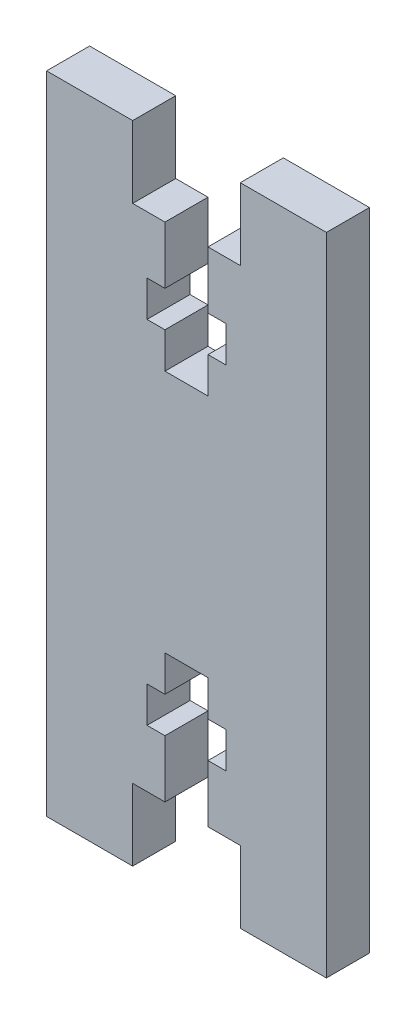
ISO-10303-21;
HEADER;
FILE_DESCRIPTION(('STEP AP214'),'2;1');
FILE_NAME('part.step','',(''),(''),'','','');
FILE_SCHEMA(('AUTOMOTIVE_DESIGN { 1 0 10303 214 1 1 1 1 }'));
ENDSEC;
DATA;
#1=APPLICATION_CONTEXT('core data for automotive mechanical design processes');
#2=APPLICATION_PROTOCOL_DEFINITION('international standard','automotive_design',2000,#1);
#3=PRODUCT_CONTEXT('',#1,'mechanical');
#4=PRODUCT('Part','Part','',(#3));
#5=PRODUCT_RELATED_PRODUCT_CATEGORY('part','',(#4));
#6=PRODUCT_DEFINITION_FORMATION('','',#4);
#7=PRODUCT_DEFINITION_CONTEXT('part definition',#1,'design');
#8=PRODUCT_DEFINITION('design','',#6,#7);
#9=PRODUCT_DEFINITION_SHAPE('','',#8);
#10=(LENGTH_UNIT() NAMED_UNIT(*) SI_UNIT(.MILLI.,.METRE.));
#11=(NAMED_UNIT(*) PLANE_ANGLE_UNIT() SI_UNIT($,.RADIAN.));
#12=(NAMED_UNIT(*) SI_UNIT($,.STERADIAN.) SOLID_ANGLE_UNIT());
#13=UNCERTAINTY_MEASURE_WITH_UNIT(LENGTH_MEASURE(1.E-05),#10,'distance_accuracy_value','');
#14=(GEOMETRIC_REPRESENTATION_CONTEXT(3) GLOBAL_UNCERTAINTY_ASSIGNED_CONTEXT((#13)) GLOBAL_UNIT_ASSIGNED_CONTEXT((#10,
#11,#12)) REPRESENTATION_CONTEXT('',''));
#15=CARTESIAN_POINT('',(0.,0.,0.));
#16=DIRECTION('',(0.,0.,1.));
#17=DIRECTION('',(1.,0.,0.));
#18=AXIS2_PLACEMENT_3D('',#15,#16,#17);
#19=CARTESIAN_POINT('',(0.,0.,3.));
#20=DIRECTION('',(-1.,0.,0.));
#21=DIRECTION('',(0.,0.,1.));
#22=AXIS2_PLACEMENT_3D('',#19,#20,#21);
#23=PLANE('',#22);
#24=DIRECTION('',(0.,1.,0.));
#25=VECTOR('',#24,1.);
#26=CARTESIAN_POINT('',(0.,0.,0.));
#27=LINE('',#26,#25);
#28=CARTESIAN_POINT('',(0.,0.,0.));
#29=VERTEX_POINT('',#28);
#30=CARTESIAN_POINT('',(0.,5.,0.));
#31=VERTEX_POINT('',#30);
#32=EDGE_CURVE('E308',#29,#31,#27,.T.);
#33=ORIENTED_EDGE('',*,*,#32,.T.);
#34=DIRECTION('',(0.,0.,-1.));
#35=VECTOR('',#34,1.);
#36=CARTESIAN_POINT('',(0.,5.,3.));
#37=LINE('',#36,#35);
#38=CARTESIAN_POINT('',(0.,5.,3.));
#39=VERTEX_POINT('',#38);
#40=EDGE_CURVE('E11',#39,#31,#37,.T.);
#41=ORIENTED_EDGE('',*,*,#40,.F.);
#42=DIRECTION('',(0.,1.,0.));
#43=VECTOR('',#42,1.);
#44=CARTESIAN_POINT('',(0.,0.,3.));
#45=LINE('',#44,#43);
#46=CARTESIAN_POINT('',(0.,0.,3.));
#47=VERTEX_POINT('',#46);
#48=EDGE_CURVE('E416',#47,#39,#45,.T.);
#49=ORIENTED_EDGE('',*,*,#48,.F.);
#50=DIRECTION('',(0.,0.,-1.));
#51=VECTOR('',#50,1.);
#52=CARTESIAN_POINT('',(0.,0.,3.));
#53=LINE('',#52,#51);
#54=EDGE_CURVE('E304',#47,#29,#53,.T.);
#55=ORIENTED_EDGE('',*,*,#54,.T.);
#56=EDGE_LOOP('',(#33,#41,#49,#55));
#57=FACE_BOUND('',#56,.T.);
#58=ADVANCED_FACE('F39',(#57),#23,.F.);
#59=CARTESIAN_POINT('',(0.,5.,3.));
#60=DIRECTION('',(0.,-1.,0.));
#61=DIRECTION('',(1.,0.,0.));
#62=AXIS2_PLACEMENT_3D('',#59,#60,#61);
#63=PLANE('',#62);
#64=DIRECTION('',(-1.,0.,0.));
#65=VECTOR('',#64,1.);
#66=CARTESIAN_POINT('',(0.,5.,0.));
#67=LINE('',#66,#65);
#68=CARTESIAN_POINT('',(-6.,5.,0.));
#69=VERTEX_POINT('',#68);
#70=EDGE_CURVE('E312',#31,#69,#67,.T.);
#71=ORIENTED_EDGE('',*,*,#70,.T.);
#72=DIRECTION('',(0.,0.,-1.));
#73=VECTOR('',#72,1.);
#74=CARTESIAN_POINT('',(-6.,5.,3.));
#75=LINE('',#74,#73);
#76=CARTESIAN_POINT('',(-6.,5.,3.));
#77=VERTEX_POINT('',#76);
#78=EDGE_CURVE('E48',#77,#69,#75,.T.);
#79=ORIENTED_EDGE('',*,*,#78,.F.);
#80=DIRECTION('',(-1.,0.,0.));
#81=VECTOR('',#80,1.);
#82=CARTESIAN_POINT('',(0.,5.,3.));
#83=LINE('',#82,#81);
#84=EDGE_CURVE('E183',#39,#77,#83,.T.);
#85=ORIENTED_EDGE('',*,*,#84,.F.);
#86=ORIENTED_EDGE('',*,*,#40,.T.);
#87=EDGE_LOOP('',(#71,#79,#85,#86));
#88=FACE_BOUND('',#87,.T.);
#89=ADVANCED_FACE('F549',(#88),#63,.F.);
#90=CARTESIAN_POINT('',(-6.,-40.,3.));
#91=DIRECTION('',(1.,0.,0.));
#92=DIRECTION('',(0.,0.,-1.));
#93=AXIS2_PLACEMENT_3D('',#90,#91,#92);
#94=PLANE('',#93);
#95=DIRECTION('',(0.,-1.,0.));
#96=VECTOR('',#95,1.);
#97=CARTESIAN_POINT('',(-6.,-40.,0.));
#98=LINE('',#97,#96);
#99=CARTESIAN_POINT('',(-6.,-40.,0.));
#100=VERTEX_POINT('',#99);
#101=EDGE_CURVE('E316',#69,#100,#98,.T.);
#102=ORIENTED_EDGE('',*,*,#101,.T.);
#103=DIRECTION('',(0.,0.,-1.));
#104=VECTOR('',#103,1.);
#105=CARTESIAN_POINT('',(-6.,-40.,3.));
#106=LINE('',#105,#104);
#107=CARTESIAN_POINT('',(-6.,-40.,3.));
#108=VERTEX_POINT('',#107);
#109=EDGE_CURVE('E539',#108,#100,#106,.T.);
#110=ORIENTED_EDGE('',*,*,#109,.F.);
#111=DIRECTION('',(0.,-1.,0.));
#112=VECTOR('',#111,1.);
#113=CARTESIAN_POINT('',(-6.,5.,3.));
#114=LINE('',#113,#112);
#115=EDGE_CURVE('E548',#77,#108,#114,.T.);
#116=ORIENTED_EDGE('',*,*,#115,.F.);
#117=ORIENTED_EDGE('',*,*,#78,.T.);
#118=EDGE_LOOP('',(#102,#110,#116,#117));
#119=FACE_BOUND('',#118,.T.);
#120=ADVANCED_FACE('F546',(#119),#94,.F.);
#121=CARTESIAN_POINT('',(0.,-40.,3.));
#122=DIRECTION('',(0.,1.,0.));
#123=DIRECTION('',(-1.,0.,0.));
#124=AXIS2_PLACEMENT_3D('',#121,#122,#123);
#125=PLANE('',#124);
#126=DIRECTION('',(1.,0.,0.));
#127=VECTOR('',#126,1.);
#128=CARTESIAN_POINT('',(0.,-40.,0.));
#129=LINE('',#128,#127);
#130=CARTESIAN_POINT('',(0.,-40.,0.));
#131=VERTEX_POINT('',#130);
#132=EDGE_CURVE('E319',#100,#131,#129,.T.);
#133=ORIENTED_EDGE('',*,*,#132,.T.);
#134=DIRECTION('',(0.,0.,-1.));
#135=VECTOR('',#134,1.);
#136=CARTESIAN_POINT('',(0.,-40.,3.));
#137=LINE('',#136,#135);
#138=CARTESIAN_POINT('',(0.,-40.,3.));
#139=VERTEX_POINT('',#138);
#140=EDGE_CURVE('E535',#139,#131,#137,.T.);
#141=ORIENTED_EDGE('',*,*,#140,.F.);
#142=DIRECTION('',(1.,0.,0.));
#143=VECTOR('',#142,1.);
#144=CARTESIAN_POINT('',(0.,-40.,3.));
#145=LINE('',#144,#143);
#146=EDGE_CURVE('E569',#108,#139,#145,.T.);
#147=ORIENTED_EDGE('',*,*,#146,.F.);
#148=ORIENTED_EDGE('',*,*,#109,.T.);
#149=EDGE_LOOP('',(#133,#141,#147,#148));
#150=FACE_BOUND('',#149,.T.);
#151=ADVANCED_FACE('F559',(#150),#125,.F.);
#152=CARTESIAN_POINT('',(0.,-35.,3.));
#153=DIRECTION('',(-1.,0.,0.));
#154=DIRECTION('',(0.,0.,1.));
#155=AXIS2_PLACEMENT_3D('',#152,#153,#154);
#156=PLANE('',#155);
#157=DIRECTION('',(0.,1.,0.));
#158=VECTOR('',#157,1.);
#159=CARTESIAN_POINT('',(0.,-35.,0.));
#160=LINE('',#159,#158);
#161=CARTESIAN_POINT('',(0.,-35.,0.));
#162=VERTEX_POINT('',#161);
#163=EDGE_CURVE('E322',#131,#162,#160,.T.);
#164=ORIENTED_EDGE('',*,*,#163,.T.);
#165=DIRECTION('',(0.,0.,-1.));
#166=VECTOR('',#165,1.);
#167=CARTESIAN_POINT('',(0.,-35.,3.));
#168=LINE('',#167,#166);
#169=CARTESIAN_POINT('',(0.,-35.,3.));
#170=VERTEX_POINT('',#169);
#171=EDGE_CURVE('E531',#170,#162,#168,.T.);
#172=ORIENTED_EDGE('',*,*,#171,.F.);
#173=DIRECTION('',(0.,1.,0.));
#174=VECTOR('',#173,1.);
#175=CARTESIAN_POINT('',(0.,-35.,3.));
#176=LINE('',#175,#174);
#177=EDGE_CURVE('E565',#139,#170,#176,.T.);
#178=ORIENTED_EDGE('',*,*,#177,.F.);
#179=ORIENTED_EDGE('',*,*,#140,.T.);
#180=EDGE_LOOP('',(#164,#172,#178,#179));
#181=FACE_BOUND('',#180,.T.);
#182=ADVANCED_FACE('F563',(#181),#156,.F.);
#183=CARTESIAN_POINT('',(0.,-35.,3.));
#184=DIRECTION('',(0.,1.,0.));
#185=DIRECTION('',(-1.,0.,0.));
#186=AXIS2_PLACEMENT_3D('',#183,#184,#185);
#187=PLANE('',#186);
#188=DIRECTION('',(1.,0.,0.));
#189=VECTOR('',#188,1.);
#190=CARTESIAN_POINT('',(0.,-35.,0.));
#191=LINE('',#190,#189);
#192=CARTESIAN_POINT('',(2.25,-35.,0.));
#193=VERTEX_POINT('',#192);
#194=EDGE_CURVE('E325',#162,#193,#191,.T.);
#195=ORIENTED_EDGE('',*,*,#194,.T.);
#196=DIRECTION('',(0.,0.,-1.));
#197=VECTOR('',#196,1.);
#198=CARTESIAN_POINT('',(2.25,-35.,3.));
#199=LINE('',#198,#197);
#200=CARTESIAN_POINT('',(2.25,-35.,3.));
#201=VERTEX_POINT('',#200);
#202=EDGE_CURVE('E527',#201,#193,#199,.T.);
#203=ORIENTED_EDGE('',*,*,#202,.F.);
#204=DIRECTION('',(1.,0.,0.));
#205=VECTOR('',#204,1.);
#206=CARTESIAN_POINT('',(0.,-35.,3.));
#207=LINE('',#206,#205);
#208=EDGE_CURVE('E568',#170,#201,#207,.T.);
#209=ORIENTED_EDGE('',*,*,#208,.F.);
#210=ORIENTED_EDGE('',*,*,#171,.T.);
#211=EDGE_LOOP('',(#195,#203,#209,#210));
#212=FACE_BOUND('',#211,.T.);
#213=ADVANCED_FACE('F789',(#212),#187,.F.);
#214=CARTESIAN_POINT('',(2.24999999999993,-31.,3.));
#215=DIRECTION('',(-1.,0.,0.));
#216=DIRECTION('',(0.,-1.,0.));
#217=AXIS2_PLACEMENT_3D('',#214,#215,#216);
#218=PLANE('',#217);
#219=DIRECTION('',(0.,1.,0.));
#220=VECTOR('',#219,1.);
#221=CARTESIAN_POINT('',(2.24999999999993,-31.,0.));
#222=LINE('',#221,#220);
#223=CARTESIAN_POINT('',(2.24999999999993,-31.,0.));
#224=VERTEX_POINT('',#223);
#225=EDGE_CURVE('E328',#193,#224,#222,.T.);
#226=ORIENTED_EDGE('',*,*,#225,.T.);
#227=DIRECTION('',(0.,0.,-1.));
#228=VECTOR('',#227,1.);
#229=CARTESIAN_POINT('',(2.24999999999993,-31.,3.));
#230=LINE('',#229,#228);
#231=CARTESIAN_POINT('',(2.24999999999993,-31.,3.));
#232=VERTEX_POINT('',#231);
#233=EDGE_CURVE('E523',#232,#224,#230,.T.);
#234=ORIENTED_EDGE('',*,*,#233,.F.);
#235=DIRECTION('',(0.,1.,0.));
#236=VECTOR('',#235,1.);
#237=CARTESIAN_POINT('',(2.24999999999993,-31.,3.));
#238=LINE('',#237,#236);
#239=EDGE_CURVE('E573',#201,#232,#238,.T.);
#240=ORIENTED_EDGE('',*,*,#239,.F.);
#241=ORIENTED_EDGE('',*,*,#202,.T.);
#242=EDGE_LOOP('',(#226,#234,#240,#241));
#243=FACE_BOUND('',#242,.T.);
#244=ADVANCED_FACE('F785',(#243),#218,.F.);
#245=CARTESIAN_POINT('',(0.999999999999927,-31.,3.));
#246=DIRECTION('',(0.,-1.,0.));
#247=DIRECTION('',(1.,0.,0.));
#248=AXIS2_PLACEMENT_3D('',#245,#246,#247);
#249=PLANE('',#248);
#250=DIRECTION('',(-1.,0.,0.));
#251=VECTOR('',#250,1.);
#252=CARTESIAN_POINT('',(0.999999999999927,-31.,0.));
#253=LINE('',#252,#251);
#254=CARTESIAN_POINT('',(0.999999999999927,-31.,0.));
#255=VERTEX_POINT('',#254);
#256=EDGE_CURVE('E331',#224,#255,#253,.T.);
#257=ORIENTED_EDGE('',*,*,#256,.T.);
#258=DIRECTION('',(0.,0.,-1.));
#259=VECTOR('',#258,1.);
#260=CARTESIAN_POINT('',(0.999999999999927,-31.,3.));
#261=LINE('',#260,#259);
#262=CARTESIAN_POINT('',(0.999999999999927,-31.,3.));
#263=VERTEX_POINT('',#262);
#264=EDGE_CURVE('E519',#263,#255,#261,.T.);
#265=ORIENTED_EDGE('',*,*,#264,.F.);
#266=DIRECTION('',(-1.,0.,0.));
#267=VECTOR('',#266,1.);
#268=CARTESIAN_POINT('',(0.999999999999927,-31.,3.));
#269=LINE('',#268,#267);
#270=EDGE_CURVE('E580',#232,#263,#269,.T.);
#271=ORIENTED_EDGE('',*,*,#270,.F.);
#272=ORIENTED_EDGE('',*,*,#233,.T.);
#273=EDGE_LOOP('',(#257,#265,#271,#272));
#274=FACE_BOUND('',#273,.T.);
#275=ADVANCED_FACE('F781',(#274),#249,.F.);
#276=CARTESIAN_POINT('',(0.999999999999882,-28.5,3.));
#277=DIRECTION('',(-1.,0.,0.));
#278=DIRECTION('',(0.,-1.,0.));
#279=AXIS2_PLACEMENT_3D('',#276,#277,#278);
#280=PLANE('',#279);
#281=DIRECTION('',(0.,1.,0.));
#282=VECTOR('',#281,1.);
#283=CARTESIAN_POINT('',(0.999999999999882,-28.5,0.));
#284=LINE('',#283,#282);
#285=CARTESIAN_POINT('',(0.999999999999882,-28.5,0.));
#286=VERTEX_POINT('',#285);
#287=EDGE_CURVE('E334',#255,#286,#284,.T.);
#288=ORIENTED_EDGE('',*,*,#287,.T.);
#289=DIRECTION('',(0.,0.,-1.));
#290=VECTOR('',#289,1.);
#291=CARTESIAN_POINT('',(0.999999999999882,-28.5,3.));
#292=LINE('',#291,#290);
#293=CARTESIAN_POINT('',(0.999999999999882,-28.5,3.));
#294=VERTEX_POINT('',#293);
#295=EDGE_CURVE('E515',#294,#286,#292,.T.);
#296=ORIENTED_EDGE('',*,*,#295,.F.);
#297=DIRECTION('',(0.,1.,0.));
#298=VECTOR('',#297,1.);
#299=CARTESIAN_POINT('',(0.999999999999882,-28.5,3.));
#300=LINE('',#299,#298);
#301=EDGE_CURVE('E583',#263,#294,#300,.T.);
#302=ORIENTED_EDGE('',*,*,#301,.F.);
#303=ORIENTED_EDGE('',*,*,#264,.T.);
#304=EDGE_LOOP('',(#288,#296,#302,#303));
#305=FACE_BOUND('',#304,.T.);
#306=ADVANCED_FACE('F777',(#305),#280,.F.);
#307=CARTESIAN_POINT('',(2.2499999999999,-28.5,3.));
#308=DIRECTION('',(0.,1.,0.));
#309=DIRECTION('',(-1.,0.,0.));
#310=AXIS2_PLACEMENT_3D('',#307,#308,#309);
#311=PLANE('',#310);
#312=DIRECTION('',(1.,0.,0.));
#313=VECTOR('',#312,1.);
#314=CARTESIAN_POINT('',(2.2499999999999,-28.5,0.));
#315=LINE('',#314,#313);
#316=CARTESIAN_POINT('',(2.2499999999999,-28.5,0.));
#317=VERTEX_POINT('',#316);
#318=EDGE_CURVE('E337',#286,#317,#315,.T.);
#319=ORIENTED_EDGE('',*,*,#318,.T.);
#320=DIRECTION('',(0.,0.,-1.));
#321=VECTOR('',#320,1.);
#322=CARTESIAN_POINT('',(2.2499999999999,-28.5,3.));
#323=LINE('',#322,#321);
#324=CARTESIAN_POINT('',(2.2499999999999,-28.5,3.));
#325=VERTEX_POINT('',#324);
#326=EDGE_CURVE('E511',#325,#317,#323,.T.);
#327=ORIENTED_EDGE('',*,*,#326,.F.);
#328=DIRECTION('',(1.,0.,0.));
#329=VECTOR('',#328,1.);
#330=CARTESIAN_POINT('',(2.2499999999999,-28.5,3.));
#331=LINE('',#330,#329);
#332=EDGE_CURVE('E586',#294,#325,#331,.T.);
#333=ORIENTED_EDGE('',*,*,#332,.F.);
#334=ORIENTED_EDGE('',*,*,#295,.T.);
#335=EDGE_LOOP('',(#319,#327,#333,#334));
#336=FACE_BOUND('',#335,.T.);
#337=ADVANCED_FACE('F772',(#336),#311,.F.);
#338=CARTESIAN_POINT('',(2.24999999999986,-26.,3.));
#339=DIRECTION('',(-1.,0.,0.));
#340=DIRECTION('',(0.,-1.,0.));
#341=AXIS2_PLACEMENT_3D('',#338,#339,#340);
#342=PLANE('',#341);
#343=DIRECTION('',(0.,1.,0.));
#344=VECTOR('',#343,1.);
#345=CARTESIAN_POINT('',(2.24999999999986,-26.,0.));
#346=LINE('',#345,#344);
#347=CARTESIAN_POINT('',(2.24999999999986,-26.,0.));
#348=VERTEX_POINT('',#347);
#349=EDGE_CURVE('E340',#317,#348,#346,.T.);
#350=ORIENTED_EDGE('',*,*,#349,.T.);
#351=DIRECTION('',(0.,0.,-1.));
#352=VECTOR('',#351,1.);
#353=CARTESIAN_POINT('',(2.24999999999986,-26.,3.));
#354=LINE('',#353,#352);
#355=CARTESIAN_POINT('',(2.24999999999986,-26.,3.));
#356=VERTEX_POINT('',#355);
#357=EDGE_CURVE('E507',#356,#348,#354,.T.);
#358=ORIENTED_EDGE('',*,*,#357,.F.);
#359=DIRECTION('',(0.,1.,0.));
#360=VECTOR('',#359,1.);
#361=CARTESIAN_POINT('',(2.24999999999986,-26.,3.));
#362=LINE('',#361,#360);
#363=EDGE_CURVE('E589',#325,#356,#362,.T.);
#364=ORIENTED_EDGE('',*,*,#363,.F.);
#365=ORIENTED_EDGE('',*,*,#326,.T.);
#366=EDGE_LOOP('',(#350,#358,#364,#365));
#367=FACE_BOUND('',#366,.T.);
#368=ADVANCED_FACE('F766',(#367),#342,.F.);
#369=CARTESIAN_POINT('',(5.24999999999985,-26.,3.));
#370=DIRECTION('',(0.,1.,0.));
#371=DIRECTION('',(-1.,0.,0.));
#372=AXIS2_PLACEMENT_3D('',#369,#370,#371);
#373=PLANE('',#372);
#374=DIRECTION('',(1.,0.,0.));
#375=VECTOR('',#374,1.);
#376=CARTESIAN_POINT('',(5.24999999999985,-26.,0.));
#377=LINE('',#376,#375);
#378=CARTESIAN_POINT('',(5.24999999999985,-26.,0.));
#379=VERTEX_POINT('',#378);
#380=EDGE_CURVE('E343',#348,#379,#377,.T.);
#381=ORIENTED_EDGE('',*,*,#380,.T.);
#382=DIRECTION('',(0.,0.,-1.));
#383=VECTOR('',#382,1.);
#384=CARTESIAN_POINT('',(5.24999999999985,-26.,3.));
#385=LINE('',#384,#383);
#386=CARTESIAN_POINT('',(5.24999999999985,-26.,3.));
#387=VERTEX_POINT('',#386);
#388=EDGE_CURVE('E503',#387,#379,#385,.T.);
#389=ORIENTED_EDGE('',*,*,#388,.F.);
#390=DIRECTION('',(1.,0.,0.));
#391=VECTOR('',#390,1.);
#392=CARTESIAN_POINT('',(5.24999999999985,-26.,3.));
#393=LINE('',#392,#391);
#394=EDGE_CURVE('E592',#356,#387,#393,.T.);
#395=ORIENTED_EDGE('',*,*,#394,.F.);
#396=ORIENTED_EDGE('',*,*,#357,.T.);
#397=EDGE_LOOP('',(#381,#389,#395,#396));
#398=FACE_BOUND('',#397,.T.);
#399=ADVANCED_FACE('F762',(#398),#373,.F.);
#400=CARTESIAN_POINT('',(5.2499999999999,-28.5,3.));
#401=DIRECTION('',(1.,0.,0.));
#402=DIRECTION('',(0.,1.,0.));
#403=AXIS2_PLACEMENT_3D('',#400,#401,#402);
#404=PLANE('',#403);
#405=DIRECTION('',(0.,-1.,0.));
#406=VECTOR('',#405,1.);
#407=CARTESIAN_POINT('',(5.2499999999999,-28.5,0.));
#408=LINE('',#407,#406);
#409=CARTESIAN_POINT('',(5.2499999999999,-28.5,0.));
#410=VERTEX_POINT('',#409);
#411=EDGE_CURVE('E346',#379,#410,#408,.T.);
#412=ORIENTED_EDGE('',*,*,#411,.T.);
#413=DIRECTION('',(0.,0.,-1.));
#414=VECTOR('',#413,1.);
#415=CARTESIAN_POINT('',(5.2499999999999,-28.5,3.));
#416=LINE('',#415,#414);
#417=CARTESIAN_POINT('',(5.2499999999999,-28.5,3.));
#418=VERTEX_POINT('',#417);
#419=EDGE_CURVE('E499',#418,#410,#416,.T.);
#420=ORIENTED_EDGE('',*,*,#419,.F.);
#421=DIRECTION('',(0.,-1.,0.));
#422=VECTOR('',#421,1.);
#423=CARTESIAN_POINT('',(5.2499999999999,-28.5,3.));
#424=LINE('',#423,#422);
#425=EDGE_CURVE('E595',#387,#418,#424,.T.);
#426=ORIENTED_EDGE('',*,*,#425,.F.);
#427=ORIENTED_EDGE('',*,*,#388,.T.);
#428=EDGE_LOOP('',(#412,#420,#426,#427));
#429=FACE_BOUND('',#428,.T.);
#430=ADVANCED_FACE('F757',(#429),#404,.F.);
#431=CARTESIAN_POINT('',(6.4999999999999,-28.4999999999999,3.));
#432=DIRECTION('',(0.,1.,0.));
#433=DIRECTION('',(-1.,0.,0.));
#434=AXIS2_PLACEMENT_3D('',#431,#432,#433);
#435=PLANE('',#434);
#436=DIRECTION('',(1.,0.,0.));
#437=VECTOR('',#436,1.);
#438=CARTESIAN_POINT('',(6.4999999999999,-28.4999999999999,0.));
#439=LINE('',#438,#437);
#440=CARTESIAN_POINT('',(6.4999999999999,-28.4999999999999,0.));
#441=VERTEX_POINT('',#440);
#442=EDGE_CURVE('E349',#410,#441,#439,.T.);
#443=ORIENTED_EDGE('',*,*,#442,.T.);
#444=DIRECTION('',(0.,0.,-1.));
#445=VECTOR('',#444,1.);
#446=CARTESIAN_POINT('',(6.4999999999999,-28.4999999999999,3.));
#447=LINE('',#446,#445);
#448=CARTESIAN_POINT('',(6.4999999999999,-28.4999999999999,3.));
#449=VERTEX_POINT('',#448);
#450=EDGE_CURVE('E495',#449,#441,#447,.T.);
#451=ORIENTED_EDGE('',*,*,#450,.F.);
#452=DIRECTION('',(1.,0.,0.));
#453=VECTOR('',#452,1.);
#454=CARTESIAN_POINT('',(6.4999999999999,-28.4999999999999,3.));
#455=LINE('',#454,#453);
#456=EDGE_CURVE('E598',#418,#449,#455,.T.);
#457=ORIENTED_EDGE('',*,*,#456,.F.);
#458=ORIENTED_EDGE('',*,*,#419,.T.);
#459=EDGE_LOOP('',(#443,#451,#457,#458));
#460=FACE_BOUND('',#459,.T.);
#461=ADVANCED_FACE('F751',(#460),#435,.F.);
#462=CARTESIAN_POINT('',(6.49999999999994,-31.,3.));
#463=DIRECTION('',(1.,0.,0.));
#464=DIRECTION('',(0.,1.,0.));
#465=AXIS2_PLACEMENT_3D('',#462,#463,#464);
#466=PLANE('',#465);
#467=DIRECTION('',(0.,-1.,0.));
#468=VECTOR('',#467,1.);
#469=CARTESIAN_POINT('',(6.49999999999994,-31.,0.));
#470=LINE('',#469,#468);
#471=CARTESIAN_POINT('',(6.49999999999994,-31.,0.));
#472=VERTEX_POINT('',#471);
#473=EDGE_CURVE('E352',#441,#472,#470,.T.);
#474=ORIENTED_EDGE('',*,*,#473,.T.);
#475=DIRECTION('',(0.,0.,-1.));
#476=VECTOR('',#475,1.);
#477=CARTESIAN_POINT('',(6.49999999999994,-31.,3.));
#478=LINE('',#477,#476);
#479=CARTESIAN_POINT('',(6.49999999999994,-31.,3.));
#480=VERTEX_POINT('',#479);
#481=EDGE_CURVE('E491',#480,#472,#478,.T.);
#482=ORIENTED_EDGE('',*,*,#481,.F.);
#483=DIRECTION('',(0.,-1.,0.));
#484=VECTOR('',#483,1.);
#485=CARTESIAN_POINT('',(6.49999999999994,-31.,3.));
#486=LINE('',#485,#484);
#487=EDGE_CURVE('E601',#449,#480,#486,.T.);
#488=ORIENTED_EDGE('',*,*,#487,.F.);
#489=ORIENTED_EDGE('',*,*,#450,.T.);
#490=EDGE_LOOP('',(#474,#482,#488,#489));
#491=FACE_BOUND('',#490,.T.);
#492=ADVANCED_FACE('F747',(#491),#466,.F.);
#493=CARTESIAN_POINT('',(6.49999999999994,-31.,3.));
#494=DIRECTION('',(0.,-1.,0.));
#495=DIRECTION('',(1.,0.,0.));
#496=AXIS2_PLACEMENT_3D('',#493,#494,#495);
#497=PLANE('',#496);
#498=DIRECTION('',(-1.,0.,0.));
#499=VECTOR('',#498,1.);
#500=CARTESIAN_POINT('',(6.49999999999994,-31.,0.));
#501=LINE('',#500,#499);
#502=CARTESIAN_POINT('',(5.24999999999993,-31.,0.));
#503=VERTEX_POINT('',#502);
#504=EDGE_CURVE('E355',#472,#503,#501,.T.);
#505=ORIENTED_EDGE('',*,*,#504,.T.);
#506=DIRECTION('',(0.,0.,-1.));
#507=VECTOR('',#506,1.);
#508=CARTESIAN_POINT('',(5.24999999999993,-31.,3.));
#509=LINE('',#508,#507);
#510=CARTESIAN_POINT('',(5.24999999999993,-31.,3.));
#511=VERTEX_POINT('',#510);
#512=EDGE_CURVE('E487',#511,#503,#509,.T.);
#513=ORIENTED_EDGE('',*,*,#512,.F.);
#514=DIRECTION('',(-1.,0.,0.));
#515=VECTOR('',#514,1.);
#516=CARTESIAN_POINT('',(6.49999999999994,-31.,3.));
#517=LINE('',#516,#515);
#518=EDGE_CURVE('E604',#480,#511,#517,.T.);
#519=ORIENTED_EDGE('',*,*,#518,.F.);
#520=ORIENTED_EDGE('',*,*,#481,.T.);
#521=EDGE_LOOP('',(#505,#513,#519,#520));
#522=FACE_BOUND('',#521,.T.);
#523=ADVANCED_FACE('F742',(#522),#497,.F.);
#524=CARTESIAN_POINT('',(5.24999999999993,-31.,3.));
#525=DIRECTION('',(1.,0.,0.));
#526=DIRECTION('',(0.,1.,0.));
#527=AXIS2_PLACEMENT_3D('',#524,#525,#526);
#528=PLANE('',#527);
#529=DIRECTION('',(0.,-1.,0.));
#530=VECTOR('',#529,1.);
#531=CARTESIAN_POINT('',(5.24999999999993,-31.,0.));
#532=LINE('',#531,#530);
#533=CARTESIAN_POINT('',(5.25,-35.,0.));
#534=VERTEX_POINT('',#533);
#535=EDGE_CURVE('E358',#503,#534,#532,.T.);
#536=ORIENTED_EDGE('',*,*,#535,.T.);
#537=DIRECTION('',(0.,0.,-1.));
#538=VECTOR('',#537,1.);
#539=CARTESIAN_POINT('',(5.25,-35.,3.));
#540=LINE('',#539,#538);
#541=CARTESIAN_POINT('',(5.25,-35.,3.));
#542=VERTEX_POINT('',#541);
#543=EDGE_CURVE('E483',#542,#534,#540,.T.);
#544=ORIENTED_EDGE('',*,*,#543,.F.);
#545=DIRECTION('',(0.,-1.,0.));
#546=VECTOR('',#545,1.);
#547=CARTESIAN_POINT('',(5.24999999999993,-31.,3.));
#548=LINE('',#547,#546);
#549=EDGE_CURVE('E607',#511,#542,#548,.T.);
#550=ORIENTED_EDGE('',*,*,#549,.F.);
#551=ORIENTED_EDGE('',*,*,#512,.T.);
#552=EDGE_LOOP('',(#536,#544,#550,#551));
#553=FACE_BOUND('',#552,.T.);
#554=ADVANCED_FACE('F736',(#553),#528,.F.);
#555=CARTESIAN_POINT('',(5.25,-35.,3.));
#556=DIRECTION('',(0.,1.,0.));
#557=DIRECTION('',(-1.,0.,0.));
#558=AXIS2_PLACEMENT_3D('',#555,#556,#557);
#559=PLANE('',#558);
#560=DIRECTION('',(1.,0.,0.));
#561=VECTOR('',#560,1.);
#562=CARTESIAN_POINT('',(5.25,-35.,0.));
#563=LINE('',#562,#561);
#564=CARTESIAN_POINT('',(7.5,-35.,0.));
#565=VERTEX_POINT('',#564);
#566=EDGE_CURVE('E361',#534,#565,#563,.T.);
#567=ORIENTED_EDGE('',*,*,#566,.T.);
#568=DIRECTION('',(0.,0.,-1.));
#569=VECTOR('',#568,1.);
#570=CARTESIAN_POINT('',(7.5,-35.,3.));
#571=LINE('',#570,#569);
#572=CARTESIAN_POINT('',(7.5,-35.,3.));
#573=VERTEX_POINT('',#572);
#574=EDGE_CURVE('E479',#573,#565,#571,.T.);
#575=ORIENTED_EDGE('',*,*,#574,.F.);
#576=DIRECTION('',(1.,0.,0.));
#577=VECTOR('',#576,1.);
#578=CARTESIAN_POINT('',(5.25,-35.,3.));
#579=LINE('',#578,#577);
#580=EDGE_CURVE('E610',#542,#573,#579,.T.);
#581=ORIENTED_EDGE('',*,*,#580,.F.);
#582=ORIENTED_EDGE('',*,*,#543,.T.);
#583=EDGE_LOOP('',(#567,#575,#581,#582));
#584=FACE_BOUND('',#583,.T.);
#585=ADVANCED_FACE('F732',(#584),#559,.F.);
#586=CARTESIAN_POINT('',(7.5,-35.,3.));
#587=DIRECTION('',(1.,0.,0.));
#588=DIRECTION('',(0.,0.,-1.));
#589=AXIS2_PLACEMENT_3D('',#586,#587,#588);
#590=PLANE('',#589);
#591=DIRECTION('',(0.,-1.,0.));
#592=VECTOR('',#591,1.);
#593=CARTESIAN_POINT('',(7.5,-35.,0.));
#594=LINE('',#593,#592);
#595=CARTESIAN_POINT('',(7.5,-40.,0.));
#596=VERTEX_POINT('',#595);
#597=EDGE_CURVE('E364',#565,#596,#594,.T.);
#598=ORIENTED_EDGE('',*,*,#597,.T.);
#599=DIRECTION('',(0.,0.,-1.));
#600=VECTOR('',#599,1.);
#601=CARTESIAN_POINT('',(7.5,-40.,3.));
#602=LINE('',#601,#600);
#603=CARTESIAN_POINT('',(7.5,-40.,3.));
#604=VERTEX_POINT('',#603);
#605=EDGE_CURVE('E475',#604,#596,#602,.T.);
#606=ORIENTED_EDGE('',*,*,#605,.F.);
#607=DIRECTION('',(0.,-1.,0.));
#608=VECTOR('',#607,1.);
#609=CARTESIAN_POINT('',(7.5,-35.,3.));
#610=LINE('',#609,#608);
#611=EDGE_CURVE('E613',#573,#604,#610,.T.);
#612=ORIENTED_EDGE('',*,*,#611,.F.);
#613=ORIENTED_EDGE('',*,*,#574,.T.);
#614=EDGE_LOOP('',(#598,#606,#612,#613));
#615=FACE_BOUND('',#614,.T.);
#616=ADVANCED_FACE('F727',(#615),#590,.F.);
#617=CARTESIAN_POINT('',(7.5,-40.,3.));
#618=DIRECTION('',(0.,1.,0.));
#619=DIRECTION('',(0.,0.,1.));
#620=AXIS2_PLACEMENT_3D('',#617,#618,#619);
#621=PLANE('',#620);
#622=DIRECTION('',(1.,0.,0.));
#623=VECTOR('',#622,1.);
#624=CARTESIAN_POINT('',(7.5,-40.,0.));
#625=LINE('',#624,#623);
#626=CARTESIAN_POINT('',(13.5,-40.,0.));
#627=VERTEX_POINT('',#626);
#628=EDGE_CURVE('E367',#596,#627,#625,.T.);
#629=ORIENTED_EDGE('',*,*,#628,.T.);
#630=DIRECTION('',(0.,0.,-1.));
#631=VECTOR('',#630,1.);
#632=CARTESIAN_POINT('',(13.5,-40.,3.));
#633=LINE('',#632,#631);
#634=CARTESIAN_POINT('',(13.5,-40.,3.));
#635=VERTEX_POINT('',#634);
#636=EDGE_CURVE('E471',#635,#627,#633,.T.);
#637=ORIENTED_EDGE('',*,*,#636,.F.);
#638=DIRECTION('',(1.,0.,0.));
#639=VECTOR('',#638,1.);
#640=CARTESIAN_POINT('',(7.5,-40.,3.));
#641=LINE('',#640,#639);
#642=EDGE_CURVE('E616',#604,#635,#641,.T.);
#643=ORIENTED_EDGE('',*,*,#642,.F.);
#644=ORIENTED_EDGE('',*,*,#605,.T.);
#645=EDGE_LOOP('',(#629,#637,#643,#644));
#646=FACE_BOUND('',#645,.T.);
#647=ADVANCED_FACE('F721',(#646),#621,.F.);
#648=CARTESIAN_POINT('',(13.5,5.,3.));
#649=DIRECTION('',(-1.,0.,0.));
#650=DIRECTION('',(0.,0.,1.));
#651=AXIS2_PLACEMENT_3D('',#648,#649,#650);
#652=PLANE('',#651);
#653=DIRECTION('',(0.,1.,0.));
#654=VECTOR('',#653,1.);
#655=CARTESIAN_POINT('',(13.5,5.,0.));
#656=LINE('',#655,#654);
#657=CARTESIAN_POINT('',(13.5,5.,0.));
#658=VERTEX_POINT('',#657);
#659=EDGE_CURVE('E371',#627,#658,#656,.T.);
#660=ORIENTED_EDGE('',*,*,#659,.T.);
#661=DIRECTION('',(0.,0.,-1.));
#662=VECTOR('',#661,1.);
#663=CARTESIAN_POINT('',(13.5,5.,3.));
#664=LINE('',#663,#662);
#665=CARTESIAN_POINT('',(13.5,5.,3.));
#666=VERTEX_POINT('',#665);
#667=EDGE_CURVE('E467',#666,#658,#664,.T.);
#668=ORIENTED_EDGE('',*,*,#667,.F.);
#669=DIRECTION('',(0.,1.,0.));
#670=VECTOR('',#669,1.);
#671=CARTESIAN_POINT('',(13.5,-40.,3.));
#672=LINE('',#671,#670);
#673=EDGE_CURVE('E619',#635,#666,#672,.T.);
#674=ORIENTED_EDGE('',*,*,#673,.F.);
#675=ORIENTED_EDGE('',*,*,#636,.T.);
#676=EDGE_LOOP('',(#660,#668,#674,#675));
#677=FACE_BOUND('',#676,.T.);
#678=ADVANCED_FACE('F717',(#677),#652,.F.);
#679=CARTESIAN_POINT('',(7.5,5.,3.));
#680=DIRECTION('',(0.,-1.,0.));
#681=DIRECTION('',(0.,0.,-1.));
#682=AXIS2_PLACEMENT_3D('',#679,#680,#681);
#683=PLANE('',#682);
#684=DIRECTION('',(-1.,0.,0.));
#685=VECTOR('',#684,1.);
#686=CARTESIAN_POINT('',(7.5,5.,0.));
#687=LINE('',#686,#685);
#688=CARTESIAN_POINT('',(7.5,5.,0.));
#689=VERTEX_POINT('',#688);
#690=EDGE_CURVE('E374',#658,#689,#687,.T.);
#691=ORIENTED_EDGE('',*,*,#690,.T.);
#692=DIRECTION('',(0.,0.,-1.));
#693=VECTOR('',#692,1.);
#694=CARTESIAN_POINT('',(7.5,5.,3.));
#695=LINE('',#694,#693);
#696=CARTESIAN_POINT('',(7.5,5.,3.));
#697=VERTEX_POINT('',#696);
#698=EDGE_CURVE('E463',#697,#689,#695,.T.);
#699=ORIENTED_EDGE('',*,*,#698,.F.);
#700=DIRECTION('',(-1.,0.,0.));
#701=VECTOR('',#700,1.);
#702=CARTESIAN_POINT('',(7.5,5.,3.));
#703=LINE('',#702,#701);
#704=EDGE_CURVE('E622',#666,#697,#703,.T.);
#705=ORIENTED_EDGE('',*,*,#704,.F.);
#706=ORIENTED_EDGE('',*,*,#667,.T.);
#707=EDGE_LOOP('',(#691,#699,#705,#706));
#708=FACE_BOUND('',#707,.T.);
#709=ADVANCED_FACE('F712',(#708),#683,.F.);
#710=CARTESIAN_POINT('',(7.5,0.,3.));
#711=DIRECTION('',(1.,0.,0.));
#712=DIRECTION('',(0.,0.,-1.));
#713=AXIS2_PLACEMENT_3D('',#710,#711,#712);
#714=PLANE('',#713);
#715=DIRECTION('',(0.,-1.,0.));
#716=VECTOR('',#715,1.);
#717=CARTESIAN_POINT('',(7.5,0.,0.));
#718=LINE('',#717,#716);
#719=CARTESIAN_POINT('',(7.5,0.,0.));
#720=VERTEX_POINT('',#719);
#721=EDGE_CURVE('E377',#689,#720,#718,.T.);
#722=ORIENTED_EDGE('',*,*,#721,.T.);
#723=DIRECTION('',(0.,0.,-1.));
#724=VECTOR('',#723,1.);
#725=CARTESIAN_POINT('',(7.5,0.,3.));
#726=LINE('',#725,#724);
#727=CARTESIAN_POINT('',(7.5,0.,3.));
#728=VERTEX_POINT('',#727);
#729=EDGE_CURVE('E459',#728,#720,#726,.T.);
#730=ORIENTED_EDGE('',*,*,#729,.F.);
#731=DIRECTION('',(0.,-1.,0.));
#732=VECTOR('',#731,1.);
#733=CARTESIAN_POINT('',(7.5,0.,3.));
#734=LINE('',#733,#732);
#735=EDGE_CURVE('E625',#697,#728,#734,.T.);
#736=ORIENTED_EDGE('',*,*,#735,.F.);
#737=ORIENTED_EDGE('',*,*,#698,.T.);
#738=EDGE_LOOP('',(#722,#730,#736,#737));
#739=FACE_BOUND('',#738,.T.);
#740=ADVANCED_FACE('F707',(#739),#714,.F.);
#741=CARTESIAN_POINT('',(5.25000000000028,0.,3.));
#742=DIRECTION('',(0.,-1.,0.));
#743=DIRECTION('',(1.,0.,0.));
#744=AXIS2_PLACEMENT_3D('',#741,#742,#743);
#745=PLANE('',#744);
#746=DIRECTION('',(-1.,0.,0.));
#747=VECTOR('',#746,1.);
#748=CARTESIAN_POINT('',(5.25000000000028,0.,0.));
#749=LINE('',#748,#747);
#750=CARTESIAN_POINT('',(5.25000000000028,0.,0.));
#751=VERTEX_POINT('',#750);
#752=EDGE_CURVE('E380',#720,#751,#749,.T.);
#753=ORIENTED_EDGE('',*,*,#752,.T.);
#754=DIRECTION('',(0.,0.,-1.));
#755=VECTOR('',#754,1.);
#756=CARTESIAN_POINT('',(5.25000000000028,0.,3.));
#757=LINE('',#756,#755);
#758=CARTESIAN_POINT('',(5.25000000000028,0.,3.));
#759=VERTEX_POINT('',#758);
#760=EDGE_CURVE('E455',#759,#751,#757,.T.);
#761=ORIENTED_EDGE('',*,*,#760,.F.);
#762=DIRECTION('',(-1.,0.,0.));
#763=VECTOR('',#762,1.);
#764=CARTESIAN_POINT('',(5.25000000000028,0.,3.));
#765=LINE('',#764,#763);
#766=EDGE_CURVE('E628',#728,#759,#765,.T.);
#767=ORIENTED_EDGE('',*,*,#766,.F.);
#768=ORIENTED_EDGE('',*,*,#729,.T.);
#769=EDGE_LOOP('',(#753,#761,#767,#768));
#770=FACE_BOUND('',#769,.T.);
#771=ADVANCED_FACE('F703',(#770),#745,.F.);
#772=CARTESIAN_POINT('',(5.25000000000028,-4.00000000000012,3.));
#773=DIRECTION('',(1.,0.,0.));
#774=DIRECTION('',(0.,0.,-1.));
#775=AXIS2_PLACEMENT_3D('',#772,#773,#774);
#776=PLANE('',#775);
#777=DIRECTION('',(0.,-1.,0.));
#778=VECTOR('',#777,1.);
#779=CARTESIAN_POINT('',(5.25000000000028,-4.00000000000012,0.));
#780=LINE('',#779,#778);
#781=CARTESIAN_POINT('',(5.25000000000028,-4.00000000000012,0.));
#782=VERTEX_POINT('',#781);
#783=EDGE_CURVE('E383',#751,#782,#780,.T.);
#784=ORIENTED_EDGE('',*,*,#783,.T.);
#785=DIRECTION('',(0.,0.,-1.));
#786=VECTOR('',#785,1.);
#787=CARTESIAN_POINT('',(5.25000000000028,-4.00000000000012,3.));
#788=LINE('',#787,#786);
#789=CARTESIAN_POINT('',(5.25000000000028,-4.00000000000012,3.));
#790=VERTEX_POINT('',#789);
#791=EDGE_CURVE('E451',#790,#782,#788,.T.);
#792=ORIENTED_EDGE('',*,*,#791,.F.);
#793=DIRECTION('',(0.,-1.,0.));
#794=VECTOR('',#793,1.);
#795=CARTESIAN_POINT('',(5.25000000000028,-4.00000000000012,3.));
#796=LINE('',#795,#794);
#797=EDGE_CURVE('E631',#759,#790,#796,.T.);
#798=ORIENTED_EDGE('',*,*,#797,.F.);
#799=ORIENTED_EDGE('',*,*,#760,.T.);
#800=EDGE_LOOP('',(#784,#792,#798,#799));
#801=FACE_BOUND('',#800,.T.);
#802=ADVANCED_FACE('F698',(#801),#776,.F.);
#803=CARTESIAN_POINT('',(6.50000000000007,-4.00000000000012,3.));
#804=DIRECTION('',(0.,1.,0.));
#805=DIRECTION('',(0.,0.,1.));
#806=AXIS2_PLACEMENT_3D('',#803,#804,#805);
#807=PLANE('',#806);
#808=DIRECTION('',(1.,0.,0.));
#809=VECTOR('',#808,1.);
#810=CARTESIAN_POINT('',(6.50000000000007,-4.00000000000012,0.));
#811=LINE('',#810,#809);
#812=CARTESIAN_POINT('',(6.50000000000007,-4.00000000000012,0.));
#813=VERTEX_POINT('',#812);
#814=EDGE_CURVE('E386',#782,#813,#811,.T.);
#815=ORIENTED_EDGE('',*,*,#814,.T.);
#816=DIRECTION('',(0.,0.,-1.));
#817=VECTOR('',#816,1.);
#818=CARTESIAN_POINT('',(6.50000000000007,-4.00000000000012,3.));
#819=LINE('',#818,#817);
#820=CARTESIAN_POINT('',(6.50000000000007,-4.00000000000012,3.));
#821=VERTEX_POINT('',#820);
#822=EDGE_CURVE('E447',#821,#813,#819,.T.);
#823=ORIENTED_EDGE('',*,*,#822,.F.);
#824=DIRECTION('',(1.,0.,0.));
#825=VECTOR('',#824,1.);
#826=CARTESIAN_POINT('',(6.50000000000007,-4.00000000000012,3.));
#827=LINE('',#826,#825);
#828=EDGE_CURVE('E634',#790,#821,#827,.T.);
#829=ORIENTED_EDGE('',*,*,#828,.F.);
#830=ORIENTED_EDGE('',*,*,#791,.T.);
#831=EDGE_LOOP('',(#815,#823,#829,#830));
#832=FACE_BOUND('',#831,.T.);
#833=ADVANCED_FACE('F692',(#832),#807,.F.);
#834=CARTESIAN_POINT('',(6.50000000000007,-6.50000000000011,3.));
#835=DIRECTION('',(1.,0.,0.));
#836=DIRECTION('',(0.,0.,-1.));
#837=AXIS2_PLACEMENT_3D('',#834,#835,#836);
#838=PLANE('',#837);
#839=DIRECTION('',(0.,-1.,0.));
#840=VECTOR('',#839,1.);
#841=CARTESIAN_POINT('',(6.50000000000007,-6.50000000000011,0.));
#842=LINE('',#841,#840);
#843=CARTESIAN_POINT('',(6.50000000000007,-6.50000000000011,0.));
#844=VERTEX_POINT('',#843);
#845=EDGE_CURVE('E389',#813,#844,#842,.T.);
#846=ORIENTED_EDGE('',*,*,#845,.T.);
#847=DIRECTION('',(0.,0.,-1.));
#848=VECTOR('',#847,1.);
#849=CARTESIAN_POINT('',(6.50000000000007,-6.50000000000011,3.));
#850=LINE('',#849,#848);
#851=CARTESIAN_POINT('',(6.50000000000007,-6.50000000000011,3.));
#852=VERTEX_POINT('',#851);
#853=EDGE_CURVE('E443',#852,#844,#850,.T.);
#854=ORIENTED_EDGE('',*,*,#853,.F.);
#855=DIRECTION('',(0.,-1.,0.));
#856=VECTOR('',#855,1.);
#857=CARTESIAN_POINT('',(6.50000000000007,-6.50000000000011,3.));
#858=LINE('',#857,#856);
#859=EDGE_CURVE('E637',#821,#852,#858,.T.);
#860=ORIENTED_EDGE('',*,*,#859,.F.);
#861=ORIENTED_EDGE('',*,*,#822,.T.);
#862=EDGE_LOOP('',(#846,#854,#860,#861));
#863=FACE_BOUND('',#862,.T.);
#864=ADVANCED_FACE('F688',(#863),#838,.F.);
#865=CARTESIAN_POINT('',(5.24999999999997,-6.50000000000011,3.));
#866=DIRECTION('',(0.,-1.,0.));
#867=DIRECTION('',(0.,0.,-1.));
#868=AXIS2_PLACEMENT_3D('',#865,#866,#867);
#869=PLANE('',#868);
#870=DIRECTION('',(-1.,0.,0.));
#871=VECTOR('',#870,1.);
#872=CARTESIAN_POINT('',(5.24999999999997,-6.50000000000011,0.));
#873=LINE('',#872,#871);
#874=CARTESIAN_POINT('',(5.24999999999997,-6.50000000000011,0.));
#875=VERTEX_POINT('',#874);
#876=EDGE_CURVE('E392',#844,#875,#873,.T.);
#877=ORIENTED_EDGE('',*,*,#876,.T.);
#878=DIRECTION('',(0.,0.,-1.));
#879=VECTOR('',#878,1.);
#880=CARTESIAN_POINT('',(5.24999999999997,-6.50000000000011,3.));
#881=LINE('',#880,#879);
#882=CARTESIAN_POINT('',(5.24999999999997,-6.50000000000011,3.));
#883=VERTEX_POINT('',#882);
#884=EDGE_CURVE('E439',#883,#875,#881,.T.);
#885=ORIENTED_EDGE('',*,*,#884,.F.);
#886=DIRECTION('',(-1.,0.,0.));
#887=VECTOR('',#886,1.);
#888=CARTESIAN_POINT('',(5.24999999999997,-6.50000000000011,3.));
#889=LINE('',#888,#887);
#890=EDGE_CURVE('E640',#852,#883,#889,.T.);
#891=ORIENTED_EDGE('',*,*,#890,.F.);
#892=ORIENTED_EDGE('',*,*,#853,.T.);
#893=EDGE_LOOP('',(#877,#885,#891,#892));
#894=FACE_BOUND('',#893,.T.);
#895=ADVANCED_FACE('F683',(#894),#869,.F.);
#896=CARTESIAN_POINT('',(5.24999999999997,-9.00000000000003,3.));
#897=DIRECTION('',(1.,0.,0.));
#898=DIRECTION('',(0.,0.,-1.));
#899=AXIS2_PLACEMENT_3D('',#896,#897,#898);
#900=PLANE('',#899);
#901=DIRECTION('',(0.,-1.,0.));
#902=VECTOR('',#901,1.);
#903=CARTESIAN_POINT('',(5.24999999999997,-9.00000000000003,0.));
#904=LINE('',#903,#902);
#905=CARTESIAN_POINT('',(5.24999999999997,-9.00000000000003,0.));
#906=VERTEX_POINT('',#905);
#907=EDGE_CURVE('E395',#875,#906,#904,.T.);
#908=ORIENTED_EDGE('',*,*,#907,.T.);
#909=DIRECTION('',(0.,0.,-1.));
#910=VECTOR('',#909,1.);
#911=CARTESIAN_POINT('',(5.24999999999997,-9.00000000000003,3.));
#912=LINE('',#911,#910);
#913=CARTESIAN_POINT('',(5.24999999999997,-9.00000000000003,3.));
#914=VERTEX_POINT('',#913);
#915=EDGE_CURVE('E435',#914,#906,#912,.T.);
#916=ORIENTED_EDGE('',*,*,#915,.F.);
#917=DIRECTION('',(0.,-1.,0.));
#918=VECTOR('',#917,1.);
#919=CARTESIAN_POINT('',(5.24999999999997,-9.00000000000003,3.));
#920=LINE('',#919,#918);
#921=EDGE_CURVE('E643',#883,#914,#920,.T.);
#922=ORIENTED_EDGE('',*,*,#921,.F.);
#923=ORIENTED_EDGE('',*,*,#884,.T.);
#924=EDGE_LOOP('',(#908,#916,#922,#923));
#925=FACE_BOUND('',#924,.T.);
#926=ADVANCED_FACE('F677',(#925),#900,.F.);
#927=CARTESIAN_POINT('',(2.25000000000009,-9.00000000000003,3.));
#928=DIRECTION('',(0.,-1.,0.));
#929=DIRECTION('',(0.,0.,-1.));
#930=AXIS2_PLACEMENT_3D('',#927,#928,#929);
#931=PLANE('',#930);
#932=DIRECTION('',(-1.,0.,0.));
#933=VECTOR('',#932,1.);
#934=CARTESIAN_POINT('',(2.25000000000009,-9.00000000000003,0.));
#935=LINE('',#934,#933);
#936=CARTESIAN_POINT('',(2.25000000000009,-9.00000000000003,0.));
#937=VERTEX_POINT('',#936);
#938=EDGE_CURVE('E398',#906,#937,#935,.T.);
#939=ORIENTED_EDGE('',*,*,#938,.T.);
#940=DIRECTION('',(0.,0.,-1.));
#941=VECTOR('',#940,1.);
#942=CARTESIAN_POINT('',(2.25000000000009,-9.00000000000003,3.));
#943=LINE('',#942,#941);
#944=CARTESIAN_POINT('',(2.25000000000009,-9.00000000000003,3.));
#945=VERTEX_POINT('',#944);
#946=EDGE_CURVE('E431',#945,#937,#943,.T.);
#947=ORIENTED_EDGE('',*,*,#946,.F.);
#948=DIRECTION('',(-1.,0.,0.));
#949=VECTOR('',#948,1.);
#950=CARTESIAN_POINT('',(2.25000000000009,-9.00000000000003,3.));
#951=LINE('',#950,#949);
#952=EDGE_CURVE('E646',#914,#945,#951,.T.);
#953=ORIENTED_EDGE('',*,*,#952,.F.);
#954=ORIENTED_EDGE('',*,*,#915,.T.);
#955=EDGE_LOOP('',(#939,#947,#953,#954));
#956=FACE_BOUND('',#955,.T.);
#957=ADVANCED_FACE('F673',(#956),#931,.F.);
#958=CARTESIAN_POINT('',(2.25000000000006,-6.50000000000003,3.));
#959=DIRECTION('',(-1.,0.,0.));
#960=DIRECTION('',(0.,-1.,0.));
#961=AXIS2_PLACEMENT_3D('',#958,#959,#960);
#962=PLANE('',#961);
#963=DIRECTION('',(0.,1.,0.));
#964=VECTOR('',#963,1.);
#965=CARTESIAN_POINT('',(2.25000000000006,-6.50000000000003,0.));
#966=LINE('',#965,#964);
#967=CARTESIAN_POINT('',(2.25000000000006,-6.50000000000003,0.));
#968=VERTEX_POINT('',#967);
#969=EDGE_CURVE('E401',#937,#968,#966,.T.);
#970=ORIENTED_EDGE('',*,*,#969,.T.);
#971=DIRECTION('',(0.,0.,-1.));
#972=VECTOR('',#971,1.);
#973=CARTESIAN_POINT('',(2.25000000000006,-6.50000000000003,3.));
#974=LINE('',#973,#972);
#975=CARTESIAN_POINT('',(2.25000000000006,-6.50000000000003,3.));
#976=VERTEX_POINT('',#975);
#977=EDGE_CURVE('E427',#976,#968,#974,.T.);
#978=ORIENTED_EDGE('',*,*,#977,.F.);
#979=DIRECTION('',(0.,1.,0.));
#980=VECTOR('',#979,1.);
#981=CARTESIAN_POINT('',(2.25000000000006,-6.50000000000003,3.));
#982=LINE('',#981,#980);
#983=EDGE_CURVE('E649',#945,#976,#982,.T.);
#984=ORIENTED_EDGE('',*,*,#983,.F.);
#985=ORIENTED_EDGE('',*,*,#946,.T.);
#986=EDGE_LOOP('',(#970,#978,#984,#985));
#987=FACE_BOUND('',#986,.T.);
#988=ADVANCED_FACE('F669',(#987),#962,.F.);
#989=CARTESIAN_POINT('',(1.00000000000005,-6.50000000000005,3.));
#990=DIRECTION('',(0.,-1.,0.));
#991=DIRECTION('',(1.,0.,0.));
#992=AXIS2_PLACEMENT_3D('',#989,#990,#991);
#993=PLANE('',#992);
#994=DIRECTION('',(-1.,0.,0.));
#995=VECTOR('',#994,1.);
#996=CARTESIAN_POINT('',(1.00000000000005,-6.50000000000005,0.));
#997=LINE('',#996,#995);
#998=CARTESIAN_POINT('',(1.00000000000005,-6.50000000000005,0.));
#999=VERTEX_POINT('',#998);
#1000=EDGE_CURVE('E404',#968,#999,#997,.T.);
#1001=ORIENTED_EDGE('',*,*,#1000,.T.);
#1002=DIRECTION('',(0.,0.,-1.));
#1003=VECTOR('',#1002,1.);
#1004=CARTESIAN_POINT('',(1.00000000000005,-6.50000000000005,3.));
#1005=LINE('',#1004,#1003);
#1006=CARTESIAN_POINT('',(1.00000000000005,-6.50000000000005,3.));
#1007=VERTEX_POINT('',#1006);
#1008=EDGE_CURVE('E423',#1007,#999,#1005,.T.);
#1009=ORIENTED_EDGE('',*,*,#1008,.F.);
#1010=DIRECTION('',(-1.,0.,0.));
#1011=VECTOR('',#1010,1.);
#1012=CARTESIAN_POINT('',(1.00000000000005,-6.50000000000005,3.));
#1013=LINE('',#1012,#1011);
#1014=EDGE_CURVE('E652',#976,#1007,#1013,.T.);
#1015=ORIENTED_EDGE('',*,*,#1014,.F.);
#1016=ORIENTED_EDGE('',*,*,#977,.T.);
#1017=EDGE_LOOP('',(#1001,#1009,#1015,#1016));
#1018=FACE_BOUND('',#1017,.T.);
#1019=ADVANCED_FACE('F660',(#1018),#993,.F.);
#1020=CARTESIAN_POINT('',(1.00000000000003,-4.00000000000004,3.));
#1021=DIRECTION('',(-1.,0.,0.));
#1022=DIRECTION('',(0.,-1.,0.));
#1023=AXIS2_PLACEMENT_3D('',#1020,#1021,#1022);
#1024=PLANE('',#1023);
#1025=DIRECTION('',(0.,1.,0.));
#1026=VECTOR('',#1025,1.);
#1027=CARTESIAN_POINT('',(1.00000000000003,-4.00000000000004,0.));
#1028=LINE('',#1027,#1026);
#1029=CARTESIAN_POINT('',(1.00000000000003,-4.00000000000004,0.));
#1030=VERTEX_POINT('',#1029);
#1031=EDGE_CURVE('E407',#999,#1030,#1028,.T.);
#1032=ORIENTED_EDGE('',*,*,#1031,.T.);
#1033=DIRECTION('',(0.,0.,-1.));
#1034=VECTOR('',#1033,1.);
#1035=CARTESIAN_POINT('',(1.00000000000003,-4.00000000000004,3.));
#1036=LINE('',#1035,#1034);
#1037=CARTESIAN_POINT('',(1.00000000000003,-4.00000000000004,3.));
#1038=VERTEX_POINT('',#1037);
#1039=EDGE_CURVE('E297',#1038,#1030,#1036,.T.);
#1040=ORIENTED_EDGE('',*,*,#1039,.F.);
#1041=DIRECTION('',(0.,1.,0.));
#1042=VECTOR('',#1041,1.);
#1043=CARTESIAN_POINT('',(1.00000000000003,-4.00000000000004,3.));
#1044=LINE('',#1043,#1042);
#1045=EDGE_CURVE('E286',#1007,#1038,#1044,.T.);
#1046=ORIENTED_EDGE('',*,*,#1045,.F.);
#1047=ORIENTED_EDGE('',*,*,#1008,.T.);
#1048=EDGE_LOOP('',(#1032,#1040,#1046,#1047));
#1049=FACE_BOUND('',#1048,.T.);
#1050=ADVANCED_FACE('F664',(#1049),#1024,.F.);
#1051=CARTESIAN_POINT('',(1.00000000000003,-4.00000000000004,3.));
#1052=DIRECTION('',(0.,1.,0.));
#1053=DIRECTION('',(0.,0.,1.));
#1054=AXIS2_PLACEMENT_3D('',#1051,#1052,#1053);
#1055=PLANE('',#1054);
#1056=DIRECTION('',(1.,0.,0.));
#1057=VECTOR('',#1056,1.);
#1058=CARTESIAN_POINT('',(1.00000000000003,-4.00000000000004,0.));
#1059=LINE('',#1058,#1057);
#1060=CARTESIAN_POINT('',(2.25000000000014,-4.00000000000004,0.));
#1061=VERTEX_POINT('',#1060);
#1062=EDGE_CURVE('E295',#1030,#1061,#1059,.T.);
#1063=ORIENTED_EDGE('',*,*,#1062,.T.);
#1064=DIRECTION('',(0.,0.,-1.));
#1065=VECTOR('',#1064,1.);
#1066=CARTESIAN_POINT('',(2.25000000000014,-4.00000000000004,3.));
#1067=LINE('',#1066,#1065);
#1068=CARTESIAN_POINT('',(2.25000000000014,-4.00000000000004,3.));
#1069=VERTEX_POINT('',#1068);
#1070=EDGE_CURVE('E292',#1069,#1061,#1067,.T.);
#1071=ORIENTED_EDGE('',*,*,#1070,.F.);
#1072=DIRECTION('',(1.,0.,0.));
#1073=VECTOR('',#1072,1.);
#1074=CARTESIAN_POINT('',(1.00000000000003,-4.00000000000004,3.));
#1075=LINE('',#1074,#1073);
#1076=EDGE_CURVE('E280',#1038,#1069,#1075,.T.);
#1077=ORIENTED_EDGE('',*,*,#1076,.F.);
#1078=ORIENTED_EDGE('',*,*,#1039,.T.);
#1079=EDGE_LOOP('',(#1063,#1071,#1077,#1078));
#1080=FACE_BOUND('',#1079,.T.);
#1081=ADVANCED_FACE('F293',(#1080),#1055,.F.);
#1082=CARTESIAN_POINT('',(2.25000000000014,-4.00000000000004,3.));
#1083=DIRECTION('',(-1.,0.,0.));
#1084=DIRECTION('',(0.,0.,1.));
#1085=AXIS2_PLACEMENT_3D('',#1082,#1083,#1084);
#1086=PLANE('',#1085);
#1087=DIRECTION('',(0.,1.,0.));
#1088=VECTOR('',#1087,1.);
#1089=CARTESIAN_POINT('',(2.25000000000014,-4.00000000000004,0.));
#1090=LINE('',#1089,#1088);
#1091=CARTESIAN_POINT('',(2.25000000000014,0.,0.));
#1092=VERTEX_POINT('',#1091);
#1093=EDGE_CURVE('E169',#1061,#1092,#1090,.T.);
#1094=ORIENTED_EDGE('',*,*,#1093,.T.);
#1095=DIRECTION('',(0.,0.,-1.));
#1096=VECTOR('',#1095,1.);
#1097=CARTESIAN_POINT('',(2.25000000000014,0.,3.));
#1098=LINE('',#1097,#1096);
#1099=CARTESIAN_POINT('',(2.25000000000014,0.,3.));
#1100=VERTEX_POINT('',#1099);
#1101=EDGE_CURVE('E298',#1100,#1092,#1098,.T.);
#1102=ORIENTED_EDGE('',*,*,#1101,.F.);
#1103=DIRECTION('',(0.,1.,0.));
#1104=VECTOR('',#1103,1.);
#1105=CARTESIAN_POINT('',(2.25000000000014,-4.00000000000004,3.));
#1106=LINE('',#1105,#1104);
#1107=EDGE_CURVE('E284',#1069,#1100,#1106,.T.);
#1108=ORIENTED_EDGE('',*,*,#1107,.F.);
#1109=ORIENTED_EDGE('',*,*,#1070,.T.);
#1110=EDGE_LOOP('',(#1094,#1102,#1108,#1109));
#1111=FACE_BOUND('',#1110,.T.);
#1112=ADVANCED_FACE('F300',(#1111),#1086,.F.);
#1113=CARTESIAN_POINT('',(0.,0.,3.));
#1114=DIRECTION('',(0.,-1.,0.));
#1115=DIRECTION('',(1.,0.,0.));
#1116=AXIS2_PLACEMENT_3D('',#1113,#1114,#1115);
#1117=PLANE('',#1116);
#1118=DIRECTION('',(-1.,0.,0.));
#1119=VECTOR('',#1118,1.);
#1120=CARTESIAN_POINT('',(0.,0.,0.));
#1121=LINE('',#1120,#1119);
#1122=EDGE_CURVE('E175',#1092,#29,#1121,.T.);
#1123=ORIENTED_EDGE('',*,*,#1122,.T.);
#1124=ORIENTED_EDGE('',*,*,#54,.F.);
#1125=DIRECTION('',(-1.,0.,0.));
#1126=VECTOR('',#1125,1.);
#1127=CARTESIAN_POINT('',(0.,0.,3.));
#1128=LINE('',#1127,#1126);
#1129=EDGE_CURVE('E56',#1100,#47,#1128,.T.);
#1130=ORIENTED_EDGE('',*,*,#1129,.F.);
#1131=ORIENTED_EDGE('',*,*,#1101,.T.);
#1132=EDGE_LOOP('',(#1123,#1124,#1130,#1131));
#1133=FACE_BOUND('',#1132,.T.);
#1134=ADVANCED_FACE('F804',(#1133),#1117,.F.);
#1135=CARTESIAN_POINT('',(0.,0.,3.));
#1136=DIRECTION('',(0.,0.,1.));
#1137=DIRECTION('',(1.,0.,0.));
#1138=AXIS2_PLACEMENT_3D('',#1135,#1136,#1137);
#1139=PLANE('',#1138);
#1140=ORIENTED_EDGE('',*,*,#48,.T.);
#1141=ORIENTED_EDGE('',*,*,#84,.T.);
#1142=ORIENTED_EDGE('',*,*,#115,.T.);
#1143=ORIENTED_EDGE('',*,*,#146,.T.);
#1144=ORIENTED_EDGE('',*,*,#177,.T.);
#1145=ORIENTED_EDGE('',*,*,#208,.T.);
#1146=ORIENTED_EDGE('',*,*,#239,.T.);
#1147=ORIENTED_EDGE('',*,*,#270,.T.);
#1148=ORIENTED_EDGE('',*,*,#301,.T.);
#1149=ORIENTED_EDGE('',*,*,#332,.T.);
#1150=ORIENTED_EDGE('',*,*,#363,.T.);
#1151=ORIENTED_EDGE('',*,*,#394,.T.);
#1152=ORIENTED_EDGE('',*,*,#425,.T.);
#1153=ORIENTED_EDGE('',*,*,#456,.T.);
#1154=ORIENTED_EDGE('',*,*,#487,.T.);
#1155=ORIENTED_EDGE('',*,*,#518,.T.);
#1156=ORIENTED_EDGE('',*,*,#549,.T.);
#1157=ORIENTED_EDGE('',*,*,#580,.T.);
#1158=ORIENTED_EDGE('',*,*,#611,.T.);
#1159=ORIENTED_EDGE('',*,*,#642,.T.);
#1160=ORIENTED_EDGE('',*,*,#673,.T.);
#1161=ORIENTED_EDGE('',*,*,#704,.T.);
#1162=ORIENTED_EDGE('',*,*,#735,.T.);
#1163=ORIENTED_EDGE('',*,*,#766,.T.);
#1164=ORIENTED_EDGE('',*,*,#797,.T.);
#1165=ORIENTED_EDGE('',*,*,#828,.T.);
#1166=ORIENTED_EDGE('',*,*,#859,.T.);
#1167=ORIENTED_EDGE('',*,*,#890,.T.);
#1168=ORIENTED_EDGE('',*,*,#921,.T.);
#1169=ORIENTED_EDGE('',*,*,#952,.T.);
#1170=ORIENTED_EDGE('',*,*,#983,.T.);
#1171=ORIENTED_EDGE('',*,*,#1014,.T.);
#1172=ORIENTED_EDGE('',*,*,#1045,.T.);
#1173=ORIENTED_EDGE('',*,*,#1076,.T.);
#1174=ORIENTED_EDGE('',*,*,#1107,.T.);
#1175=ORIENTED_EDGE('',*,*,#1129,.T.);
#1176=EDGE_LOOP('',(#1140,#1141,#1142,#1143,#1144,#1145,#1146,#1147,#1148,#1149,#1150,#1151,
#1152,#1153,#1154,#1155,#1156,#1157,#1158,#1159,#1160,#1161,#1162,#1163,#1164,#1165,#1166,#1167,
#1168,#1169,#1170,#1171,#1172,#1173,#1174,#1175));
#1177=FACE_BOUND('',#1176,.T.);
#1178=ADVANCED_FACE('F282',(#1177),#1139,.T.);
#1179=CARTESIAN_POINT('',(0.,0.,0.));
#1180=DIRECTION('',(0.,0.,1.));
#1181=DIRECTION('',(1.,0.,0.));
#1182=AXIS2_PLACEMENT_3D('',#1179,#1180,#1181);
#1183=PLANE('',#1182);
#1184=ORIENTED_EDGE('',*,*,#32,.F.);
#1185=ORIENTED_EDGE('',*,*,#1122,.F.);
#1186=ORIENTED_EDGE('',*,*,#1093,.F.);
#1187=ORIENTED_EDGE('',*,*,#1062,.F.);
#1188=ORIENTED_EDGE('',*,*,#1031,.F.);
#1189=ORIENTED_EDGE('',*,*,#1000,.F.);
#1190=ORIENTED_EDGE('',*,*,#969,.F.);
#1191=ORIENTED_EDGE('',*,*,#938,.F.);
#1192=ORIENTED_EDGE('',*,*,#907,.F.);
#1193=ORIENTED_EDGE('',*,*,#876,.F.);
#1194=ORIENTED_EDGE('',*,*,#845,.F.);
#1195=ORIENTED_EDGE('',*,*,#814,.F.);
#1196=ORIENTED_EDGE('',*,*,#783,.F.);
#1197=ORIENTED_EDGE('',*,*,#752,.F.);
#1198=ORIENTED_EDGE('',*,*,#721,.F.);
#1199=ORIENTED_EDGE('',*,*,#690,.F.);
#1200=ORIENTED_EDGE('',*,*,#659,.F.);
#1201=ORIENTED_EDGE('',*,*,#628,.F.);
#1202=ORIENTED_EDGE('',*,*,#597,.F.);
#1203=ORIENTED_EDGE('',*,*,#566,.F.);
#1204=ORIENTED_EDGE('',*,*,#535,.F.);
#1205=ORIENTED_EDGE('',*,*,#504,.F.);
#1206=ORIENTED_EDGE('',*,*,#473,.F.);
#1207=ORIENTED_EDGE('',*,*,#442,.F.);
#1208=ORIENTED_EDGE('',*,*,#411,.F.);
#1209=ORIENTED_EDGE('',*,*,#380,.F.);
#1210=ORIENTED_EDGE('',*,*,#349,.F.);
#1211=ORIENTED_EDGE('',*,*,#318,.F.);
#1212=ORIENTED_EDGE('',*,*,#287,.F.);
#1213=ORIENTED_EDGE('',*,*,#256,.F.);
#1214=ORIENTED_EDGE('',*,*,#225,.F.);
#1215=ORIENTED_EDGE('',*,*,#194,.F.);
#1216=ORIENTED_EDGE('',*,*,#163,.F.);
#1217=ORIENTED_EDGE('',*,*,#132,.F.);
#1218=ORIENTED_EDGE('',*,*,#101,.F.);
#1219=ORIENTED_EDGE('',*,*,#70,.F.);
#1220=EDGE_LOOP('',(#1184,#1185,#1186,#1187,#1188,#1189,#1190,#1191,#1192,#1193,#1194,#1195,
#1196,#1197,#1198,#1199,#1200,#1201,#1202,#1203,#1204,#1205,#1206,#1207,#1208,#1209,#1210,#1211,
#1212,#1213,#1214,#1215,#1216,#1217,#1218,#1219));
#1221=FACE_BOUND('',#1220,.T.);
#1222=ADVANCED_FACE('F553',(#1221),#1183,.F.);
#1223=CLOSED_SHELL('',(#58,#89,#120,#151,#182,#213,#244,#275,#306,#337,#368,#399,#430,#461,#492,
#523,#554,#585,#616,#647,#678,#709,#740,#771,#802,#833,#864,#895,#926,#957,#988,#1019,#1050,
#1081,#1112,#1134,#1178,#1222));
#1224=MANIFOLD_SOLID_BREP('B2',#1223);
#1225=ADVANCED_BREP_SHAPE_REPRESENTATION('',(#18,#1224),#14);
#1226=SHAPE_DEFINITION_REPRESENTATION(#9,#1225);
ENDSEC;
END-ISO-10303-21;
